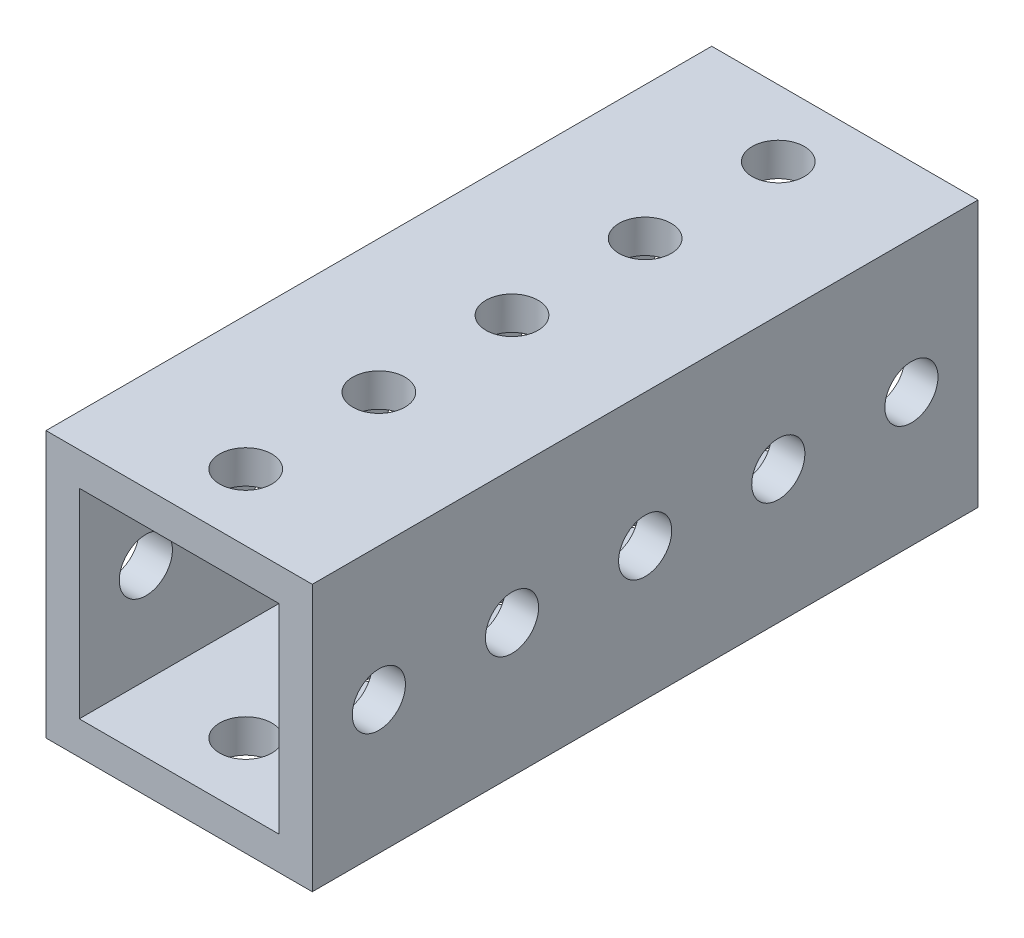
ISO-10303-21;
HEADER;
FILE_DESCRIPTION(('STEP AP214'),'2;1');
FILE_NAME('part.step','',(''),(''),'','','');
FILE_SCHEMA(('AUTOMOTIVE_DESIGN { 1 0 10303 214 1 1 1 1 }'));
ENDSEC;
DATA;
#1=APPLICATION_CONTEXT('core data for automotive mechanical design processes');
#2=APPLICATION_PROTOCOL_DEFINITION('international standard','automotive_design',2000,#1);
#3=PRODUCT_CONTEXT('',#1,'mechanical');
#4=PRODUCT('Part','Part','',(#3));
#5=PRODUCT_RELATED_PRODUCT_CATEGORY('part','',(#4));
#6=PRODUCT_DEFINITION_FORMATION('','',#4);
#7=PRODUCT_DEFINITION_CONTEXT('part definition',#1,'design');
#8=PRODUCT_DEFINITION('design','',#6,#7);
#9=PRODUCT_DEFINITION_SHAPE('','',#8);
#10=(LENGTH_UNIT() NAMED_UNIT(*) SI_UNIT(.MILLI.,.METRE.));
#11=(NAMED_UNIT(*) PLANE_ANGLE_UNIT() SI_UNIT($,.RADIAN.));
#12=(NAMED_UNIT(*) SI_UNIT($,.STERADIAN.) SOLID_ANGLE_UNIT());
#13=UNCERTAINTY_MEASURE_WITH_UNIT(LENGTH_MEASURE(1.E-05),#10,'distance_accuracy_value','');
#14=(GEOMETRIC_REPRESENTATION_CONTEXT(3) GLOBAL_UNCERTAINTY_ASSIGNED_CONTEXT((#13)) GLOBAL_UNIT_ASSIGNED_CONTEXT((#10,
#11,#12)) REPRESENTATION_CONTEXT('',''));
#15=CARTESIAN_POINT('',(0.,0.,0.));
#16=DIRECTION('',(0.,0.,1.));
#17=DIRECTION('',(1.,0.,0.));
#18=AXIS2_PLACEMENT_3D('',#15,#16,#17);
#19=CARTESIAN_POINT('',(0.,0.,63.5));
#20=DIRECTION('',(0.,0.,-1.));
#21=DIRECTION('',(-1.,0.,0.));
#22=AXIS2_PLACEMENT_3D('',#19,#20,#21);
#23=PLANE('',#22);
#24=DIRECTION('',(0.,-1.,0.));
#25=VECTOR('',#24,1.);
#26=CARTESIAN_POINT('',(0.,0.,63.5));
#27=LINE('',#26,#25);
#28=CARTESIAN_POINT('',(0.,25.4,63.5));
#29=VERTEX_POINT('',#28);
#30=CARTESIAN_POINT('',(0.,0.,63.5));
#31=VERTEX_POINT('',#30);
#32=EDGE_CURVE('E155',#29,#31,#27,.T.);
#33=ORIENTED_EDGE('',*,*,#32,.T.);
#34=DIRECTION('',(1.,0.,0.));
#35=VECTOR('',#34,1.);
#36=CARTESIAN_POINT('',(0.,0.,63.5));
#37=LINE('',#36,#35);
#38=CARTESIAN_POINT('',(25.4,0.,63.5));
#39=VERTEX_POINT('',#38);
#40=EDGE_CURVE('E159',#31,#39,#37,.T.);
#41=ORIENTED_EDGE('',*,*,#40,.T.);
#42=DIRECTION('',(0.,1.,0.));
#43=VECTOR('',#42,1.);
#44=CARTESIAN_POINT('',(25.4,0.,63.5));
#45=LINE('',#44,#43);
#46=CARTESIAN_POINT('',(25.4,25.4,63.5));
#47=VERTEX_POINT('',#46);
#48=EDGE_CURVE('E163',#39,#47,#45,.T.);
#49=ORIENTED_EDGE('',*,*,#48,.T.);
#50=DIRECTION('',(-1.,0.,0.));
#51=VECTOR('',#50,1.);
#52=CARTESIAN_POINT('',(0.,25.4,63.5));
#53=LINE('',#52,#51);
#54=EDGE_CURVE('E166',#47,#29,#53,.T.);
#55=ORIENTED_EDGE('',*,*,#54,.T.);
#56=EDGE_LOOP('',(#33,#41,#49,#55));
#57=FACE_BOUND('',#56,.T.);
#58=DIRECTION('',(0.,-1.,0.));
#59=VECTOR('',#58,1.);
#60=CARTESIAN_POINT('',(3.175,0.,63.5));
#61=LINE('',#60,#59);
#62=CARTESIAN_POINT('',(3.17499999999999,22.225,63.5));
#63=VERTEX_POINT('',#62);
#64=CARTESIAN_POINT('',(3.175,3.175,63.5));
#65=VERTEX_POINT('',#64);
#66=EDGE_CURVE('E137',#63,#65,#61,.T.);
#67=ORIENTED_EDGE('',*,*,#66,.F.);
#68=DIRECTION('',(-1.,0.,0.));
#69=VECTOR('',#68,1.);
#70=CARTESIAN_POINT('',(0.,22.225,63.5));
#71=LINE('',#70,#69);
#72=CARTESIAN_POINT('',(22.225,22.225,63.5));
#73=VERTEX_POINT('',#72);
#74=EDGE_CURVE('E118',#73,#63,#71,.T.);
#75=ORIENTED_EDGE('',*,*,#74,.F.);
#76=DIRECTION('',(0.,1.,0.));
#77=VECTOR('',#76,1.);
#78=CARTESIAN_POINT('',(22.225,0.,63.5));
#79=LINE('',#78,#77);
#80=CARTESIAN_POINT('',(22.225,3.175,63.5));
#81=VERTEX_POINT('',#80);
#82=EDGE_CURVE('E150',#81,#73,#79,.T.);
#83=ORIENTED_EDGE('',*,*,#82,.F.);
#84=DIRECTION('',(1.,0.,0.));
#85=VECTOR('',#84,1.);
#86=CARTESIAN_POINT('',(0.,3.175,63.5));
#87=LINE('',#86,#85);
#88=EDGE_CURVE('E141',#65,#81,#87,.T.);
#89=ORIENTED_EDGE('',*,*,#88,.F.);
#90=EDGE_LOOP('',(#67,#75,#83,#89));
#91=FACE_BOUND('',#90,.T.);
#92=ADVANCED_FACE('F45',(#57,#91),#23,.F.);
#93=CARTESIAN_POINT('',(0.,0.,0.));
#94=DIRECTION('',(0.,0.,-1.));
#95=DIRECTION('',(-1.,0.,0.));
#96=AXIS2_PLACEMENT_3D('',#93,#94,#95);
#97=PLANE('',#96);
#98=DIRECTION('',(0.,-1.,0.));
#99=VECTOR('',#98,1.);
#100=CARTESIAN_POINT('',(0.,0.,0.));
#101=LINE('',#100,#99);
#102=CARTESIAN_POINT('',(0.,25.4,0.));
#103=VERTEX_POINT('',#102);
#104=CARTESIAN_POINT('',(0.,0.,0.));
#105=VERTEX_POINT('',#104);
#106=EDGE_CURVE('E170',#103,#105,#101,.T.);
#107=ORIENTED_EDGE('',*,*,#106,.F.);
#108=DIRECTION('',(-1.,0.,0.));
#109=VECTOR('',#108,1.);
#110=CARTESIAN_POINT('',(0.,25.4,0.));
#111=LINE('',#110,#109);
#112=CARTESIAN_POINT('',(25.4,25.4,0.));
#113=VERTEX_POINT('',#112);
#114=EDGE_CURVE('E160',#113,#103,#111,.T.);
#115=ORIENTED_EDGE('',*,*,#114,.F.);
#116=DIRECTION('',(0.,1.,0.));
#117=VECTOR('',#116,1.);
#118=CARTESIAN_POINT('',(25.4,0.,0.));
#119=LINE('',#118,#117);
#120=CARTESIAN_POINT('',(25.4,0.,0.));
#121=VERTEX_POINT('',#120);
#122=EDGE_CURVE('E177',#121,#113,#119,.T.);
#123=ORIENTED_EDGE('',*,*,#122,.F.);
#124=DIRECTION('',(1.,0.,0.));
#125=VECTOR('',#124,1.);
#126=CARTESIAN_POINT('',(0.,0.,0.));
#127=LINE('',#126,#125);
#128=EDGE_CURVE('E174',#105,#121,#127,.T.);
#129=ORIENTED_EDGE('',*,*,#128,.F.);
#130=EDGE_LOOP('',(#107,#115,#123,#129));
#131=FACE_BOUND('',#130,.T.);
#132=DIRECTION('',(-1.,0.,0.));
#133=VECTOR('',#132,1.);
#134=CARTESIAN_POINT('',(0.,22.225,0.));
#135=LINE('',#134,#133);
#136=CARTESIAN_POINT('',(22.225,22.225,0.));
#137=VERTEX_POINT('',#136);
#138=CARTESIAN_POINT('',(3.17499999999999,22.225,0.));
#139=VERTEX_POINT('',#138);
#140=EDGE_CURVE('E116',#137,#139,#135,.T.);
#141=ORIENTED_EDGE('',*,*,#140,.T.);
#142=DIRECTION('',(0.,-1.,0.));
#143=VECTOR('',#142,1.);
#144=CARTESIAN_POINT('',(3.175,0.,0.));
#145=LINE('',#144,#143);
#146=CARTESIAN_POINT('',(3.175,3.175,0.));
#147=VERTEX_POINT('',#146);
#148=EDGE_CURVE('E125',#139,#147,#145,.T.);
#149=ORIENTED_EDGE('',*,*,#148,.T.);
#150=DIRECTION('',(1.,0.,0.));
#151=VECTOR('',#150,1.);
#152=CARTESIAN_POINT('',(0.,3.175,0.));
#153=LINE('',#152,#151);
#154=CARTESIAN_POINT('',(22.225,3.175,0.));
#155=VERTEX_POINT('',#154);
#156=EDGE_CURVE('E132',#147,#155,#153,.T.);
#157=ORIENTED_EDGE('',*,*,#156,.T.);
#158=DIRECTION('',(0.,1.,0.));
#159=VECTOR('',#158,1.);
#160=CARTESIAN_POINT('',(22.225,0.,0.));
#161=LINE('',#160,#159);
#162=EDGE_CURVE('E70',#155,#137,#161,.T.);
#163=ORIENTED_EDGE('',*,*,#162,.T.);
#164=EDGE_LOOP('',(#141,#149,#157,#163));
#165=FACE_BOUND('',#164,.T.);
#166=ADVANCED_FACE('F135',(#131,#165),#97,.T.);
#167=CARTESIAN_POINT('',(0.,0.,63.5));
#168=DIRECTION('',(1.,0.,0.));
#169=DIRECTION('',(0.,1.,0.));
#170=AXIS2_PLACEMENT_3D('',#167,#168,#169);
#171=PLANE('',#170);
#172=CARTESIAN_POINT('',(0.,12.7,57.15));
#173=DIRECTION('',(1.,0.,0.));
#174=DIRECTION('',(0.,1.,0.));
#175=AXIS2_PLACEMENT_3D('',#172,#173,#174);
#176=CIRCLE('',#175,2.53492000000001);
#177=CARTESIAN_POINT('',(0.,15.23492,57.15));
#178=VERTEX_POINT('',#177);
#179=EDGE_CURVE('E267',#178,#178,#176,.T.);
#180=ORIENTED_EDGE('',*,*,#179,.T.);
#181=EDGE_LOOP('',(#180));
#182=FACE_BOUND('',#181,.T.);
#183=CARTESIAN_POINT('',(0.,12.7,44.45));
#184=DIRECTION('',(1.,0.,0.));
#185=DIRECTION('',(0.,1.,0.));
#186=AXIS2_PLACEMENT_3D('',#183,#184,#185);
#187=CIRCLE('',#186,2.53492000000001);
#188=CARTESIAN_POINT('',(0.,15.23492,44.45));
#189=VERTEX_POINT('',#188);
#190=EDGE_CURVE('E249',#189,#189,#187,.T.);
#191=ORIENTED_EDGE('',*,*,#190,.T.);
#192=EDGE_LOOP('',(#191));
#193=FACE_BOUND('',#192,.T.);
#194=CARTESIAN_POINT('',(0.,12.7,31.75));
#195=DIRECTION('',(1.,0.,0.));
#196=DIRECTION('',(0.,1.,0.));
#197=AXIS2_PLACEMENT_3D('',#194,#195,#196);
#198=CIRCLE('',#197,2.53492000000001);
#199=CARTESIAN_POINT('',(0.,15.23492,31.75));
#200=VERTEX_POINT('',#199);
#201=EDGE_CURVE('E243',#200,#200,#198,.T.);
#202=ORIENTED_EDGE('',*,*,#201,.T.);
#203=EDGE_LOOP('',(#202));
#204=FACE_BOUND('',#203,.T.);
#205=CARTESIAN_POINT('',(0.,12.7,19.05));
#206=DIRECTION('',(1.,0.,0.));
#207=DIRECTION('',(0.,1.,0.));
#208=AXIS2_PLACEMENT_3D('',#205,#206,#207);
#209=CIRCLE('',#208,2.53492000000001);
#210=CARTESIAN_POINT('',(0.,15.23492,19.05));
#211=VERTEX_POINT('',#210);
#212=EDGE_CURVE('E238',#211,#211,#209,.T.);
#213=ORIENTED_EDGE('',*,*,#212,.T.);
#214=EDGE_LOOP('',(#213));
#215=FACE_BOUND('',#214,.T.);
#216=CARTESIAN_POINT('',(0.,12.7,6.35));
#217=DIRECTION('',(1.,0.,0.));
#218=DIRECTION('',(0.,1.,0.));
#219=AXIS2_PLACEMENT_3D('',#216,#217,#218);
#220=CIRCLE('',#219,2.53492000000001);
#221=CARTESIAN_POINT('',(0.,15.23492,6.35));
#222=VERTEX_POINT('',#221);
#223=EDGE_CURVE('E233',#222,#222,#220,.T.);
#224=ORIENTED_EDGE('',*,*,#223,.T.);
#225=EDGE_LOOP('',(#224));
#226=FACE_BOUND('',#225,.T.);
#227=ORIENTED_EDGE('',*,*,#106,.T.);
#228=DIRECTION('',(0.,0.,-1.));
#229=VECTOR('',#228,1.);
#230=CARTESIAN_POINT('',(0.,0.,63.5));
#231=LINE('',#230,#229);
#232=EDGE_CURVE('E11',#31,#105,#231,.T.);
#233=ORIENTED_EDGE('',*,*,#232,.F.);
#234=ORIENTED_EDGE('',*,*,#32,.F.);
#235=DIRECTION('',(0.,0.,-1.));
#236=VECTOR('',#235,1.);
#237=CARTESIAN_POINT('',(0.,25.4,63.5));
#238=LINE('',#237,#236);
#239=EDGE_CURVE('E169',#29,#103,#238,.T.);
#240=ORIENTED_EDGE('',*,*,#239,.T.);
#241=EDGE_LOOP('',(#227,#233,#234,#240));
#242=FACE_BOUND('',#241,.T.);
#243=ADVANCED_FACE('F47',(#182,#193,#204,#215,#226,#242),#171,.F.);
#244=CARTESIAN_POINT('',(0.,0.,63.5));
#245=DIRECTION('',(0.,1.,0.));
#246=DIRECTION('',(0.,0.,1.));
#247=AXIS2_PLACEMENT_3D('',#244,#245,#246);
#248=PLANE('',#247);
#249=CARTESIAN_POINT('',(12.7,0.,6.35));
#250=DIRECTION('',(0.,1.,0.));
#251=DIRECTION('',(0.,0.,1.));
#252=AXIS2_PLACEMENT_3D('',#249,#250,#251);
#253=CIRCLE('',#252,2.4892);
#254=CARTESIAN_POINT('',(12.7,0.,8.8392));
#255=VERTEX_POINT('',#254);
#256=EDGE_CURVE('E133',#255,#255,#253,.T.);
#257=ORIENTED_EDGE('',*,*,#256,.T.);
#258=EDGE_LOOP('',(#257));
#259=FACE_BOUND('',#258,.T.);
#260=CARTESIAN_POINT('',(12.7,0.,19.05));
#261=DIRECTION('',(0.,1.,0.));
#262=DIRECTION('',(0.,0.,1.));
#263=AXIS2_PLACEMENT_3D('',#260,#261,#262);
#264=CIRCLE('',#263,2.4892);
#265=CARTESIAN_POINT('',(12.7,0.,21.5392));
#266=VERTEX_POINT('',#265);
#267=EDGE_CURVE('E221',#266,#266,#264,.T.);
#268=ORIENTED_EDGE('',*,*,#267,.T.);
#269=EDGE_LOOP('',(#268));
#270=FACE_BOUND('',#269,.T.);
#271=CARTESIAN_POINT('',(12.7,0.,31.75));
#272=DIRECTION('',(0.,1.,0.));
#273=DIRECTION('',(0.,0.,1.));
#274=AXIS2_PLACEMENT_3D('',#271,#272,#273);
#275=CIRCLE('',#274,2.4892);
#276=CARTESIAN_POINT('',(12.7,0.,34.2392));
#277=VERTEX_POINT('',#276);
#278=EDGE_CURVE('E215',#277,#277,#275,.T.);
#279=ORIENTED_EDGE('',*,*,#278,.T.);
#280=EDGE_LOOP('',(#279));
#281=FACE_BOUND('',#280,.T.);
#282=CARTESIAN_POINT('',(12.7,0.,44.45));
#283=DIRECTION('',(0.,1.,0.));
#284=DIRECTION('',(0.,0.,1.));
#285=AXIS2_PLACEMENT_3D('',#282,#283,#284);
#286=CIRCLE('',#285,2.4892);
#287=CARTESIAN_POINT('',(12.7,0.,46.9392));
#288=VERTEX_POINT('',#287);
#289=EDGE_CURVE('E209',#288,#288,#286,.T.);
#290=ORIENTED_EDGE('',*,*,#289,.T.);
#291=EDGE_LOOP('',(#290));
#292=FACE_BOUND('',#291,.T.);
#293=CARTESIAN_POINT('',(12.7,0.,57.15));
#294=DIRECTION('',(0.,1.,0.));
#295=DIRECTION('',(0.,0.,1.));
#296=AXIS2_PLACEMENT_3D('',#293,#294,#295);
#297=CIRCLE('',#296,2.4892);
#298=CARTESIAN_POINT('',(12.7,0.,59.6392));
#299=VERTEX_POINT('',#298);
#300=EDGE_CURVE('E203',#299,#299,#297,.T.);
#301=ORIENTED_EDGE('',*,*,#300,.T.);
#302=EDGE_LOOP('',(#301));
#303=FACE_BOUND('',#302,.T.);
#304=ORIENTED_EDGE('',*,*,#128,.T.);
#305=DIRECTION('',(0.,0.,-1.));
#306=VECTOR('',#305,1.);
#307=CARTESIAN_POINT('',(25.4,0.,63.5));
#308=LINE('',#307,#306);
#309=EDGE_CURVE('E55',#39,#121,#308,.T.);
#310=ORIENTED_EDGE('',*,*,#309,.F.);
#311=ORIENTED_EDGE('',*,*,#40,.F.);
#312=ORIENTED_EDGE('',*,*,#232,.T.);
#313=EDGE_LOOP('',(#304,#310,#311,#312));
#314=FACE_BOUND('',#313,.T.);
#315=ADVANCED_FACE('F361',(#259,#270,#281,#292,#303,#314),#248,.F.);
#316=CARTESIAN_POINT('',(25.4,0.,63.5));
#317=DIRECTION('',(-1.,0.,0.));
#318=DIRECTION('',(0.,-1.,0.));
#319=AXIS2_PLACEMENT_3D('',#316,#317,#318);
#320=PLANE('',#319);
#321=CARTESIAN_POINT('',(25.4,12.7,57.15));
#322=DIRECTION('',(1.,0.,0.));
#323=DIRECTION('',(0.,1.,0.));
#324=AXIS2_PLACEMENT_3D('',#321,#322,#323);
#325=CIRCLE('',#324,2.53492000000001);
#326=CARTESIAN_POINT('',(25.4,15.23492,57.15));
#327=VERTEX_POINT('',#326);
#328=EDGE_CURVE('E227',#327,#327,#325,.T.);
#329=ORIENTED_EDGE('',*,*,#328,.F.);
#330=EDGE_LOOP('',(#329));
#331=FACE_BOUND('',#330,.T.);
#332=CARTESIAN_POINT('',(25.4,12.7,44.45));
#333=DIRECTION('',(1.,0.,0.));
#334=DIRECTION('',(0.,1.,0.));
#335=AXIS2_PLACEMENT_3D('',#332,#333,#334);
#336=CIRCLE('',#335,2.53492000000001);
#337=CARTESIAN_POINT('',(25.4,15.23492,44.45));
#338=VERTEX_POINT('',#337);
#339=EDGE_CURVE('E708',#338,#338,#336,.T.);
#340=ORIENTED_EDGE('',*,*,#339,.F.);
#341=EDGE_LOOP('',(#340));
#342=FACE_BOUND('',#341,.T.);
#343=CARTESIAN_POINT('',(25.4,12.7,31.75));
#344=DIRECTION('',(1.,0.,0.));
#345=DIRECTION('',(0.,1.,0.));
#346=AXIS2_PLACEMENT_3D('',#343,#344,#345);
#347=CIRCLE('',#346,2.53492000000001);
#348=CARTESIAN_POINT('',(25.4,15.23492,31.75));
#349=VERTEX_POINT('',#348);
#350=EDGE_CURVE('E704',#349,#349,#347,.T.);
#351=ORIENTED_EDGE('',*,*,#350,.F.);
#352=EDGE_LOOP('',(#351));
#353=FACE_BOUND('',#352,.T.);
#354=CARTESIAN_POINT('',(25.4,12.7,19.05));
#355=DIRECTION('',(1.,0.,0.));
#356=DIRECTION('',(0.,1.,0.));
#357=AXIS2_PLACEMENT_3D('',#354,#355,#356);
#358=CIRCLE('',#357,2.53492000000001);
#359=CARTESIAN_POINT('',(25.4,15.23492,19.05));
#360=VERTEX_POINT('',#359);
#361=EDGE_CURVE('E700',#360,#360,#358,.T.);
#362=ORIENTED_EDGE('',*,*,#361,.F.);
#363=EDGE_LOOP('',(#362));
#364=FACE_BOUND('',#363,.T.);
#365=CARTESIAN_POINT('',(25.4,12.7,6.35));
#366=DIRECTION('',(1.,0.,0.));
#367=DIRECTION('',(0.,1.,0.));
#368=AXIS2_PLACEMENT_3D('',#365,#366,#367);
#369=CIRCLE('',#368,2.53492000000001);
#370=CARTESIAN_POINT('',(25.4,15.23492,6.35));
#371=VERTEX_POINT('',#370);
#372=EDGE_CURVE('E696',#371,#371,#369,.T.);
#373=ORIENTED_EDGE('',*,*,#372,.F.);
#374=EDGE_LOOP('',(#373));
#375=FACE_BOUND('',#374,.T.);
#376=ORIENTED_EDGE('',*,*,#122,.T.);
#377=DIRECTION('',(0.,0.,-1.));
#378=VECTOR('',#377,1.);
#379=CARTESIAN_POINT('',(25.4,25.4,63.5));
#380=LINE('',#379,#378);
#381=EDGE_CURVE('E185',#47,#113,#380,.T.);
#382=ORIENTED_EDGE('',*,*,#381,.F.);
#383=ORIENTED_EDGE('',*,*,#48,.F.);
#384=ORIENTED_EDGE('',*,*,#309,.T.);
#385=EDGE_LOOP('',(#376,#382,#383,#384));
#386=FACE_BOUND('',#385,.T.);
#387=ADVANCED_FACE('F358',(#331,#342,#353,#364,#375,#386),#320,.F.);
#388=CARTESIAN_POINT('',(0.,25.4,63.5));
#389=DIRECTION('',(0.,-1.,0.));
#390=DIRECTION('',(0.,0.,-1.));
#391=AXIS2_PLACEMENT_3D('',#388,#389,#390);
#392=PLANE('',#391);
#393=CARTESIAN_POINT('',(12.7,25.4,6.35));
#394=DIRECTION('',(0.,1.,0.));
#395=DIRECTION('',(0.,0.,1.));
#396=AXIS2_PLACEMENT_3D('',#393,#394,#395);
#397=CIRCLE('',#396,2.4892);
#398=CARTESIAN_POINT('',(12.7,25.4,8.8392));
#399=VERTEX_POINT('',#398);
#400=EDGE_CURVE('E197',#399,#399,#397,.T.);
#401=ORIENTED_EDGE('',*,*,#400,.F.);
#402=EDGE_LOOP('',(#401));
#403=FACE_BOUND('',#402,.T.);
#404=CARTESIAN_POINT('',(12.7,25.4,19.05));
#405=DIRECTION('',(0.,1.,0.));
#406=DIRECTION('',(0.,0.,1.));
#407=AXIS2_PLACEMENT_3D('',#404,#405,#406);
#408=CIRCLE('',#407,2.4892);
#409=CARTESIAN_POINT('',(12.7,25.4,21.5392));
#410=VERTEX_POINT('',#409);
#411=EDGE_CURVE('E275',#410,#410,#408,.T.);
#412=ORIENTED_EDGE('',*,*,#411,.F.);
#413=EDGE_LOOP('',(#412));
#414=FACE_BOUND('',#413,.T.);
#415=CARTESIAN_POINT('',(12.7,25.4,31.75));
#416=DIRECTION('',(0.,1.,0.));
#417=DIRECTION('',(0.,0.,1.));
#418=AXIS2_PLACEMENT_3D('',#415,#416,#417);
#419=CIRCLE('',#418,2.4892);
#420=CARTESIAN_POINT('',(12.7,25.4,34.2392));
#421=VERTEX_POINT('',#420);
#422=EDGE_CURVE('E279',#421,#421,#419,.T.);
#423=ORIENTED_EDGE('',*,*,#422,.F.);
#424=EDGE_LOOP('',(#423));
#425=FACE_BOUND('',#424,.T.);
#426=CARTESIAN_POINT('',(12.7,25.4,44.45));
#427=DIRECTION('',(0.,1.,0.));
#428=DIRECTION('',(0.,0.,1.));
#429=AXIS2_PLACEMENT_3D('',#426,#427,#428);
#430=CIRCLE('',#429,2.4892);
#431=CARTESIAN_POINT('',(12.7,25.4,46.9392));
#432=VERTEX_POINT('',#431);
#433=EDGE_CURVE('E283',#432,#432,#430,.T.);
#434=ORIENTED_EDGE('',*,*,#433,.F.);
#435=EDGE_LOOP('',(#434));
#436=FACE_BOUND('',#435,.T.);
#437=CARTESIAN_POINT('',(12.7,25.4,57.15));
#438=DIRECTION('',(0.,1.,0.));
#439=DIRECTION('',(0.,0.,1.));
#440=AXIS2_PLACEMENT_3D('',#437,#438,#439);
#441=CIRCLE('',#440,2.4892);
#442=CARTESIAN_POINT('',(12.7,25.4,59.6392));
#443=VERTEX_POINT('',#442);
#444=EDGE_CURVE('E271',#443,#443,#441,.T.);
#445=ORIENTED_EDGE('',*,*,#444,.F.);
#446=EDGE_LOOP('',(#445));
#447=FACE_BOUND('',#446,.T.);
#448=ORIENTED_EDGE('',*,*,#114,.T.);
#449=ORIENTED_EDGE('',*,*,#239,.F.);
#450=ORIENTED_EDGE('',*,*,#54,.F.);
#451=ORIENTED_EDGE('',*,*,#381,.T.);
#452=EDGE_LOOP('',(#448,#449,#450,#451));
#453=FACE_BOUND('',#452,.T.);
#454=ADVANCED_FACE('F342',(#403,#414,#425,#436,#447,#453),#392,.F.);
#455=CARTESIAN_POINT('',(3.175,0.,63.5));
#456=DIRECTION('',(1.,0.,0.));
#457=DIRECTION('',(0.,1.,0.));
#458=AXIS2_PLACEMENT_3D('',#455,#456,#457);
#459=PLANE('',#458);
#460=CARTESIAN_POINT('',(3.175,12.7,57.15));
#461=DIRECTION('',(1.,0.,0.));
#462=DIRECTION('',(0.,1.,0.));
#463=AXIS2_PLACEMENT_3D('',#460,#461,#462);
#464=CIRCLE('',#463,2.53492000000001);
#465=CARTESIAN_POINT('',(3.175,15.23492,57.15));
#466=VERTEX_POINT('',#465);
#467=EDGE_CURVE('E263',#466,#466,#464,.T.);
#468=ORIENTED_EDGE('',*,*,#467,.F.);
#469=EDGE_LOOP('',(#468));
#470=FACE_BOUND('',#469,.T.);
#471=CARTESIAN_POINT('',(3.175,12.7,44.45));
#472=DIRECTION('',(1.,0.,0.));
#473=DIRECTION('',(0.,1.,0.));
#474=AXIS2_PLACEMENT_3D('',#471,#472,#473);
#475=CIRCLE('',#474,2.53492000000001);
#476=CARTESIAN_POINT('',(3.175,15.23492,44.45));
#477=VERTEX_POINT('',#476);
#478=EDGE_CURVE('E242',#477,#477,#475,.T.);
#479=ORIENTED_EDGE('',*,*,#478,.F.);
#480=EDGE_LOOP('',(#479));
#481=FACE_BOUND('',#480,.T.);
#482=CARTESIAN_POINT('',(3.175,12.7,31.75));
#483=DIRECTION('',(1.,0.,0.));
#484=DIRECTION('',(0.,1.,0.));
#485=AXIS2_PLACEMENT_3D('',#482,#483,#484);
#486=CIRCLE('',#485,2.53492000000001);
#487=CARTESIAN_POINT('',(3.175,15.23492,31.75));
#488=VERTEX_POINT('',#487);
#489=EDGE_CURVE('E237',#488,#488,#486,.T.);
#490=ORIENTED_EDGE('',*,*,#489,.F.);
#491=EDGE_LOOP('',(#490));
#492=FACE_BOUND('',#491,.T.);
#493=CARTESIAN_POINT('',(3.175,12.7,19.05));
#494=DIRECTION('',(1.,0.,0.));
#495=DIRECTION('',(0.,1.,0.));
#496=AXIS2_PLACEMENT_3D('',#493,#494,#495);
#497=CIRCLE('',#496,2.53492000000001);
#498=CARTESIAN_POINT('',(3.175,15.23492,19.05));
#499=VERTEX_POINT('',#498);
#500=EDGE_CURVE('E232',#499,#499,#497,.T.);
#501=ORIENTED_EDGE('',*,*,#500,.F.);
#502=EDGE_LOOP('',(#501));
#503=FACE_BOUND('',#502,.T.);
#504=CARTESIAN_POINT('',(3.175,12.7,6.35));
#505=DIRECTION('',(1.,0.,0.));
#506=DIRECTION('',(0.,1.,0.));
#507=AXIS2_PLACEMENT_3D('',#504,#505,#506);
#508=CIRCLE('',#507,2.53492000000001);
#509=CARTESIAN_POINT('',(3.175,15.23492,6.35));
#510=VERTEX_POINT('',#509);
#511=EDGE_CURVE('E226',#510,#510,#508,.T.);
#512=ORIENTED_EDGE('',*,*,#511,.F.);
#513=EDGE_LOOP('',(#512));
#514=FACE_BOUND('',#513,.T.);
#515=ORIENTED_EDGE('',*,*,#148,.F.);
#516=DIRECTION('',(0.,0.,-1.));
#517=VECTOR('',#516,1.);
#518=CARTESIAN_POINT('',(3.17499999999999,22.225,63.5));
#519=LINE('',#518,#517);
#520=EDGE_CURVE('E112',#63,#139,#519,.T.);
#521=ORIENTED_EDGE('',*,*,#520,.F.);
#522=ORIENTED_EDGE('',*,*,#66,.T.);
#523=DIRECTION('',(0.,0.,-1.));
#524=VECTOR('',#523,1.);
#525=CARTESIAN_POINT('',(3.175,3.175,63.5));
#526=LINE('',#525,#524);
#527=EDGE_CURVE('E128',#65,#147,#526,.T.);
#528=ORIENTED_EDGE('',*,*,#527,.T.);
#529=EDGE_LOOP('',(#515,#521,#522,#528));
#530=FACE_BOUND('',#529,.T.);
#531=ADVANCED_FACE('F126',(#470,#481,#492,#503,#514,#530),#459,.T.);
#532=CARTESIAN_POINT('',(0.,3.175,63.5));
#533=DIRECTION('',(0.,1.,0.));
#534=DIRECTION('',(0.,0.,1.));
#535=AXIS2_PLACEMENT_3D('',#532,#533,#534);
#536=PLANE('',#535);
#537=CARTESIAN_POINT('',(12.7,3.175,6.35));
#538=DIRECTION('',(0.,1.,0.));
#539=DIRECTION('',(0.,0.,1.));
#540=AXIS2_PLACEMENT_3D('',#537,#538,#539);
#541=CIRCLE('',#540,2.4892);
#542=CARTESIAN_POINT('',(12.7,3.175,8.8392));
#543=VERTEX_POINT('',#542);
#544=EDGE_CURVE('E220',#543,#543,#541,.T.);
#545=ORIENTED_EDGE('',*,*,#544,.F.);
#546=EDGE_LOOP('',(#545));
#547=FACE_BOUND('',#546,.T.);
#548=CARTESIAN_POINT('',(12.7,3.175,19.05));
#549=DIRECTION('',(0.,1.,0.));
#550=DIRECTION('',(0.,0.,1.));
#551=AXIS2_PLACEMENT_3D('',#548,#549,#550);
#552=CIRCLE('',#551,2.4892);
#553=CARTESIAN_POINT('',(12.7,3.175,21.5392));
#554=VERTEX_POINT('',#553);
#555=EDGE_CURVE('E214',#554,#554,#552,.T.);
#556=ORIENTED_EDGE('',*,*,#555,.F.);
#557=EDGE_LOOP('',(#556));
#558=FACE_BOUND('',#557,.T.);
#559=CARTESIAN_POINT('',(12.7,3.175,31.75));
#560=DIRECTION('',(0.,1.,0.));
#561=DIRECTION('',(0.,0.,1.));
#562=AXIS2_PLACEMENT_3D('',#559,#560,#561);
#563=CIRCLE('',#562,2.4892);
#564=CARTESIAN_POINT('',(12.7,3.175,34.2392));
#565=VERTEX_POINT('',#564);
#566=EDGE_CURVE('E208',#565,#565,#563,.T.);
#567=ORIENTED_EDGE('',*,*,#566,.F.);
#568=EDGE_LOOP('',(#567));
#569=FACE_BOUND('',#568,.T.);
#570=CARTESIAN_POINT('',(12.7,3.175,44.45));
#571=DIRECTION('',(0.,1.,0.));
#572=DIRECTION('',(0.,0.,1.));
#573=AXIS2_PLACEMENT_3D('',#570,#571,#572);
#574=CIRCLE('',#573,2.4892);
#575=CARTESIAN_POINT('',(12.7,3.175,46.9392));
#576=VERTEX_POINT('',#575);
#577=EDGE_CURVE('E202',#576,#576,#574,.T.);
#578=ORIENTED_EDGE('',*,*,#577,.F.);
#579=EDGE_LOOP('',(#578));
#580=FACE_BOUND('',#579,.T.);
#581=CARTESIAN_POINT('',(12.7,3.175,57.15));
#582=DIRECTION('',(0.,1.,0.));
#583=DIRECTION('',(0.,0.,1.));
#584=AXIS2_PLACEMENT_3D('',#581,#582,#583);
#585=CIRCLE('',#584,2.4892);
#586=CARTESIAN_POINT('',(12.7,3.175,59.6392));
#587=VERTEX_POINT('',#586);
#588=EDGE_CURVE('E196',#587,#587,#585,.T.);
#589=ORIENTED_EDGE('',*,*,#588,.F.);
#590=EDGE_LOOP('',(#589));
#591=FACE_BOUND('',#590,.T.);
#592=ORIENTED_EDGE('',*,*,#156,.F.);
#593=ORIENTED_EDGE('',*,*,#527,.F.);
#594=ORIENTED_EDGE('',*,*,#88,.T.);
#595=DIRECTION('',(0.,0.,-1.));
#596=VECTOR('',#595,1.);
#597=CARTESIAN_POINT('',(22.225,3.175,63.5));
#598=LINE('',#597,#596);
#599=EDGE_CURVE('E321',#81,#155,#598,.T.);
#600=ORIENTED_EDGE('',*,*,#599,.T.);
#601=EDGE_LOOP('',(#592,#593,#594,#600));
#602=FACE_BOUND('',#601,.T.);
#603=ADVANCED_FACE('F330',(#547,#558,#569,#580,#591,#602),#536,.T.);
#604=CARTESIAN_POINT('',(22.225,0.,63.5));
#605=DIRECTION('',(-1.,0.,0.));
#606=DIRECTION('',(0.,-1.,0.));
#607=AXIS2_PLACEMENT_3D('',#604,#605,#606);
#608=PLANE('',#607);
#609=CARTESIAN_POINT('',(22.225,12.7,57.15));
#610=DIRECTION('',(-1.,0.,0.));
#611=DIRECTION('',(0.,-1.,0.));
#612=AXIS2_PLACEMENT_3D('',#609,#610,#611);
#613=CIRCLE('',#612,2.53492000000001);
#614=CARTESIAN_POINT('',(22.225,10.16508,57.15));
#615=VERTEX_POINT('',#614);
#616=EDGE_CURVE('E49',#615,#615,#613,.T.);
#617=ORIENTED_EDGE('',*,*,#616,.F.);
#618=EDGE_LOOP('',(#617));
#619=FACE_BOUND('',#618,.T.);
#620=CARTESIAN_POINT('',(22.225,12.7,44.45));
#621=DIRECTION('',(-1.,0.,0.));
#622=DIRECTION('',(0.,-1.,0.));
#623=AXIS2_PLACEMENT_3D('',#620,#621,#622);
#624=CIRCLE('',#623,2.53492000000001);
#625=CARTESIAN_POINT('',(22.225,10.16508,44.45));
#626=VERTEX_POINT('',#625);
#627=EDGE_CURVE('E239',#626,#626,#624,.T.);
#628=ORIENTED_EDGE('',*,*,#627,.F.);
#629=EDGE_LOOP('',(#628));
#630=FACE_BOUND('',#629,.T.);
#631=CARTESIAN_POINT('',(22.225,12.7,31.75));
#632=DIRECTION('',(-1.,0.,0.));
#633=DIRECTION('',(0.,-1.,0.));
#634=AXIS2_PLACEMENT_3D('',#631,#632,#633);
#635=CIRCLE('',#634,2.53492000000001);
#636=CARTESIAN_POINT('',(22.225,10.16508,31.75));
#637=VERTEX_POINT('',#636);
#638=EDGE_CURVE('E234',#637,#637,#635,.T.);
#639=ORIENTED_EDGE('',*,*,#638,.F.);
#640=EDGE_LOOP('',(#639));
#641=FACE_BOUND('',#640,.T.);
#642=CARTESIAN_POINT('',(22.225,12.7,19.05));
#643=DIRECTION('',(-1.,0.,0.));
#644=DIRECTION('',(0.,-1.,0.));
#645=AXIS2_PLACEMENT_3D('',#642,#643,#644);
#646=CIRCLE('',#645,2.53492000000001);
#647=CARTESIAN_POINT('',(22.225,10.16508,19.05));
#648=VERTEX_POINT('',#647);
#649=EDGE_CURVE('E228',#648,#648,#646,.T.);
#650=ORIENTED_EDGE('',*,*,#649,.F.);
#651=EDGE_LOOP('',(#650));
#652=FACE_BOUND('',#651,.T.);
#653=CARTESIAN_POINT('',(22.225,12.7,6.35));
#654=DIRECTION('',(-1.,0.,0.));
#655=DIRECTION('',(0.,-1.,0.));
#656=AXIS2_PLACEMENT_3D('',#653,#654,#655);
#657=CIRCLE('',#656,2.53492000000001);
#658=CARTESIAN_POINT('',(22.225,10.16508,6.35));
#659=VERTEX_POINT('',#658);
#660=EDGE_CURVE('E222',#659,#659,#657,.T.);
#661=ORIENTED_EDGE('',*,*,#660,.F.);
#662=EDGE_LOOP('',(#661));
#663=FACE_BOUND('',#662,.T.);
#664=ORIENTED_EDGE('',*,*,#162,.F.);
#665=ORIENTED_EDGE('',*,*,#599,.F.);
#666=ORIENTED_EDGE('',*,*,#82,.T.);
#667=DIRECTION('',(0.,0.,-1.));
#668=VECTOR('',#667,1.);
#669=CARTESIAN_POINT('',(22.225,22.225,63.5));
#670=LINE('',#669,#668);
#671=EDGE_CURVE('E63',#73,#137,#670,.T.);
#672=ORIENTED_EDGE('',*,*,#671,.T.);
#673=EDGE_LOOP('',(#664,#665,#666,#672));
#674=FACE_BOUND('',#673,.T.);
#675=ADVANCED_FACE('F325',(#619,#630,#641,#652,#663,#674),#608,.T.);
#676=CARTESIAN_POINT('',(0.,22.225,63.5));
#677=DIRECTION('',(0.,-1.,0.));
#678=DIRECTION('',(0.,0.,-1.));
#679=AXIS2_PLACEMENT_3D('',#676,#677,#678);
#680=PLANE('',#679);
#681=CARTESIAN_POINT('',(12.7,22.225,6.35));
#682=DIRECTION('',(0.,-1.,0.));
#683=DIRECTION('',(0.,0.,-1.));
#684=AXIS2_PLACEMENT_3D('',#681,#682,#683);
#685=CIRCLE('',#684,2.4892);
#686=CARTESIAN_POINT('',(12.7,22.225,3.8608));
#687=VERTEX_POINT('',#686);
#688=EDGE_CURVE('E216',#687,#687,#685,.T.);
#689=ORIENTED_EDGE('',*,*,#688,.F.);
#690=EDGE_LOOP('',(#689));
#691=FACE_BOUND('',#690,.T.);
#692=CARTESIAN_POINT('',(12.7,22.225,19.05));
#693=DIRECTION('',(0.,-1.,0.));
#694=DIRECTION('',(0.,0.,-1.));
#695=AXIS2_PLACEMENT_3D('',#692,#693,#694);
#696=CIRCLE('',#695,2.4892);
#697=CARTESIAN_POINT('',(12.7,22.225,16.5608));
#698=VERTEX_POINT('',#697);
#699=EDGE_CURVE('E210',#698,#698,#696,.T.);
#700=ORIENTED_EDGE('',*,*,#699,.F.);
#701=EDGE_LOOP('',(#700));
#702=FACE_BOUND('',#701,.T.);
#703=CARTESIAN_POINT('',(12.7,22.225,31.75));
#704=DIRECTION('',(0.,-1.,0.));
#705=DIRECTION('',(0.,0.,-1.));
#706=AXIS2_PLACEMENT_3D('',#703,#704,#705);
#707=CIRCLE('',#706,2.4892);
#708=CARTESIAN_POINT('',(12.7,22.225,29.2608));
#709=VERTEX_POINT('',#708);
#710=EDGE_CURVE('E204',#709,#709,#707,.T.);
#711=ORIENTED_EDGE('',*,*,#710,.F.);
#712=EDGE_LOOP('',(#711));
#713=FACE_BOUND('',#712,.T.);
#714=CARTESIAN_POINT('',(12.7,22.225,44.45));
#715=DIRECTION('',(0.,-1.,0.));
#716=DIRECTION('',(0.,0.,-1.));
#717=AXIS2_PLACEMENT_3D('',#714,#715,#716);
#718=CIRCLE('',#717,2.4892);
#719=CARTESIAN_POINT('',(12.7,22.225,41.9608));
#720=VERTEX_POINT('',#719);
#721=EDGE_CURVE('E198',#720,#720,#718,.T.);
#722=ORIENTED_EDGE('',*,*,#721,.F.);
#723=EDGE_LOOP('',(#722));
#724=FACE_BOUND('',#723,.T.);
#725=CARTESIAN_POINT('',(12.7,22.225,57.15));
#726=DIRECTION('',(0.,-1.,0.));
#727=DIRECTION('',(0.,0.,-1.));
#728=AXIS2_PLACEMENT_3D('',#725,#726,#727);
#729=CIRCLE('',#728,2.4892);
#730=CARTESIAN_POINT('',(12.7,22.225,54.6608));
#731=VERTEX_POINT('',#730);
#732=EDGE_CURVE('E192',#731,#731,#729,.T.);
#733=ORIENTED_EDGE('',*,*,#732,.F.);
#734=EDGE_LOOP('',(#733));
#735=FACE_BOUND('',#734,.T.);
#736=ORIENTED_EDGE('',*,*,#140,.F.);
#737=ORIENTED_EDGE('',*,*,#671,.F.);
#738=ORIENTED_EDGE('',*,*,#74,.T.);
#739=ORIENTED_EDGE('',*,*,#520,.T.);
#740=EDGE_LOOP('',(#736,#737,#738,#739));
#741=FACE_BOUND('',#740,.T.);
#742=ADVANCED_FACE('F114',(#691,#702,#713,#724,#735,#741),#680,.T.);
#743=CARTESIAN_POINT('',(12.7,-38.1,57.15));
#744=DIRECTION('',(0.,1.,0.));
#745=DIRECTION('',(0.,0.,1.));
#746=AXIS2_PLACEMENT_3D('',#743,#744,#745);
#747=CYLINDRICAL_SURFACE('',#746,2.4892);
#748=ORIENTED_EDGE('',*,*,#732,.T.);
#749=EDGE_LOOP('',(#748));
#750=FACE_BOUND('',#749,.T.);
#751=ORIENTED_EDGE('',*,*,#444,.T.);
#752=EDGE_LOOP('',(#751));
#753=FACE_BOUND('',#752,.T.);
#754=ADVANCED_FACE('F399',(#750,#753),#747,.F.);
#755=CARTESIAN_POINT('',(12.7,-38.1,44.45));
#756=DIRECTION('',(0.,1.,0.));
#757=DIRECTION('',(0.,0.,1.));
#758=AXIS2_PLACEMENT_3D('',#755,#756,#757);
#759=CYLINDRICAL_SURFACE('',#758,2.4892);
#760=ORIENTED_EDGE('',*,*,#721,.T.);
#761=EDGE_LOOP('',(#760));
#762=FACE_BOUND('',#761,.T.);
#763=ORIENTED_EDGE('',*,*,#433,.T.);
#764=EDGE_LOOP('',(#763));
#765=FACE_BOUND('',#764,.T.);
#766=ADVANCED_FACE('F407',(#762,#765),#759,.F.);
#767=CARTESIAN_POINT('',(12.7,-38.1,31.75));
#768=DIRECTION('',(0.,1.,0.));
#769=DIRECTION('',(0.,0.,1.));
#770=AXIS2_PLACEMENT_3D('',#767,#768,#769);
#771=CYLINDRICAL_SURFACE('',#770,2.4892);
#772=ORIENTED_EDGE('',*,*,#710,.T.);
#773=EDGE_LOOP('',(#772));
#774=FACE_BOUND('',#773,.T.);
#775=ORIENTED_EDGE('',*,*,#422,.T.);
#776=EDGE_LOOP('',(#775));
#777=FACE_BOUND('',#776,.T.);
#778=ADVANCED_FACE('F417',(#774,#777),#771,.F.);
#779=CARTESIAN_POINT('',(12.7,-38.1,19.05));
#780=DIRECTION('',(0.,1.,0.));
#781=DIRECTION('',(0.,0.,1.));
#782=AXIS2_PLACEMENT_3D('',#779,#780,#781);
#783=CYLINDRICAL_SURFACE('',#782,2.4892);
#784=ORIENTED_EDGE('',*,*,#699,.T.);
#785=EDGE_LOOP('',(#784));
#786=FACE_BOUND('',#785,.T.);
#787=ORIENTED_EDGE('',*,*,#411,.T.);
#788=EDGE_LOOP('',(#787));
#789=FACE_BOUND('',#788,.T.);
#790=ADVANCED_FACE('F408',(#786,#789),#783,.F.);
#791=CARTESIAN_POINT('',(12.7,-38.1,6.35));
#792=DIRECTION('',(0.,1.,0.));
#793=DIRECTION('',(0.,0.,1.));
#794=AXIS2_PLACEMENT_3D('',#791,#792,#793);
#795=CYLINDRICAL_SURFACE('',#794,2.4892);
#796=ORIENTED_EDGE('',*,*,#688,.T.);
#797=EDGE_LOOP('',(#796));
#798=FACE_BOUND('',#797,.T.);
#799=ORIENTED_EDGE('',*,*,#400,.T.);
#800=EDGE_LOOP('',(#799));
#801=FACE_BOUND('',#800,.T.);
#802=ADVANCED_FACE('F396',(#798,#801),#795,.F.);
#803=ORIENTED_EDGE('',*,*,#588,.T.);
#804=EDGE_LOOP('',(#803));
#805=FACE_BOUND('',#804,.T.);
#806=ORIENTED_EDGE('',*,*,#300,.F.);
#807=EDGE_LOOP('',(#806));
#808=FACE_BOUND('',#807,.T.);
#809=ADVANCED_FACE('F393',(#805,#808),#747,.F.);
#810=ORIENTED_EDGE('',*,*,#577,.T.);
#811=EDGE_LOOP('',(#810));
#812=FACE_BOUND('',#811,.T.);
#813=ORIENTED_EDGE('',*,*,#289,.F.);
#814=EDGE_LOOP('',(#813));
#815=FACE_BOUND('',#814,.T.);
#816=ADVANCED_FACE('F395',(#812,#815),#759,.F.);
#817=ORIENTED_EDGE('',*,*,#566,.T.);
#818=EDGE_LOOP('',(#817));
#819=FACE_BOUND('',#818,.T.);
#820=ORIENTED_EDGE('',*,*,#278,.F.);
#821=EDGE_LOOP('',(#820));
#822=FACE_BOUND('',#821,.T.);
#823=ADVANCED_FACE('F404',(#819,#822),#771,.F.);
#824=ORIENTED_EDGE('',*,*,#555,.T.);
#825=EDGE_LOOP('',(#824));
#826=FACE_BOUND('',#825,.T.);
#827=ORIENTED_EDGE('',*,*,#267,.F.);
#828=EDGE_LOOP('',(#827));
#829=FACE_BOUND('',#828,.T.);
#830=ADVANCED_FACE('F448',(#826,#829),#783,.F.);
#831=ORIENTED_EDGE('',*,*,#544,.T.);
#832=EDGE_LOOP('',(#831));
#833=FACE_BOUND('',#832,.T.);
#834=ORIENTED_EDGE('',*,*,#256,.F.);
#835=EDGE_LOOP('',(#834));
#836=FACE_BOUND('',#835,.T.);
#837=ADVANCED_FACE('F411',(#833,#836),#795,.F.);
#838=CARTESIAN_POINT('',(-38.1,12.7,6.35));
#839=DIRECTION('',(1.,0.,0.));
#840=DIRECTION('',(0.,1.,0.));
#841=AXIS2_PLACEMENT_3D('',#838,#839,#840);
#842=CYLINDRICAL_SURFACE('',#841,2.53492000000001);
#843=ORIENTED_EDGE('',*,*,#660,.T.);
#844=EDGE_LOOP('',(#843));
#845=FACE_BOUND('',#844,.T.);
#846=ORIENTED_EDGE('',*,*,#372,.T.);
#847=EDGE_LOOP('',(#846));
#848=FACE_BOUND('',#847,.T.);
#849=ADVANCED_FACE('F466',(#845,#848),#842,.F.);
#850=CARTESIAN_POINT('',(-38.1,12.7,19.05));
#851=DIRECTION('',(1.,0.,0.));
#852=DIRECTION('',(0.,1.,0.));
#853=AXIS2_PLACEMENT_3D('',#850,#851,#852);
#854=CYLINDRICAL_SURFACE('',#853,2.53492000000001);
#855=ORIENTED_EDGE('',*,*,#649,.T.);
#856=EDGE_LOOP('',(#855));
#857=FACE_BOUND('',#856,.T.);
#858=ORIENTED_EDGE('',*,*,#361,.T.);
#859=EDGE_LOOP('',(#858));
#860=FACE_BOUND('',#859,.T.);
#861=ADVANCED_FACE('F472',(#857,#860),#854,.F.);
#862=CARTESIAN_POINT('',(-38.1,12.7,31.75));
#863=DIRECTION('',(1.,0.,0.));
#864=DIRECTION('',(0.,1.,0.));
#865=AXIS2_PLACEMENT_3D('',#862,#863,#864);
#866=CYLINDRICAL_SURFACE('',#865,2.53492000000001);
#867=ORIENTED_EDGE('',*,*,#638,.T.);
#868=EDGE_LOOP('',(#867));
#869=FACE_BOUND('',#868,.T.);
#870=ORIENTED_EDGE('',*,*,#350,.T.);
#871=EDGE_LOOP('',(#870));
#872=FACE_BOUND('',#871,.T.);
#873=ADVANCED_FACE('F477',(#869,#872),#866,.F.);
#874=CARTESIAN_POINT('',(-38.1,12.7,44.45));
#875=DIRECTION('',(1.,0.,0.));
#876=DIRECTION('',(0.,1.,0.));
#877=AXIS2_PLACEMENT_3D('',#874,#875,#876);
#878=CYLINDRICAL_SURFACE('',#877,2.53492000000001);
#879=ORIENTED_EDGE('',*,*,#627,.T.);
#880=EDGE_LOOP('',(#879));
#881=FACE_BOUND('',#880,.T.);
#882=ORIENTED_EDGE('',*,*,#339,.T.);
#883=EDGE_LOOP('',(#882));
#884=FACE_BOUND('',#883,.T.);
#885=ADVANCED_FACE('F482',(#881,#884),#878,.F.);
#886=CARTESIAN_POINT('',(-38.1,12.7,57.15));
#887=DIRECTION('',(1.,0.,0.));
#888=DIRECTION('',(0.,1.,0.));
#889=AXIS2_PLACEMENT_3D('',#886,#887,#888);
#890=CYLINDRICAL_SURFACE('',#889,2.53492000000001);
#891=ORIENTED_EDGE('',*,*,#616,.T.);
#892=EDGE_LOOP('',(#891));
#893=FACE_BOUND('',#892,.T.);
#894=ORIENTED_EDGE('',*,*,#328,.T.);
#895=EDGE_LOOP('',(#894));
#896=FACE_BOUND('',#895,.T.);
#897=ADVANCED_FACE('F487',(#893,#896),#890,.F.);
#898=ORIENTED_EDGE('',*,*,#511,.T.);
#899=EDGE_LOOP('',(#898));
#900=FACE_BOUND('',#899,.T.);
#901=ORIENTED_EDGE('',*,*,#223,.F.);
#902=EDGE_LOOP('',(#901));
#903=FACE_BOUND('',#902,.T.);
#904=ADVANCED_FACE('F474',(#900,#903),#842,.F.);
#905=ORIENTED_EDGE('',*,*,#500,.T.);
#906=EDGE_LOOP('',(#905));
#907=FACE_BOUND('',#906,.T.);
#908=ORIENTED_EDGE('',*,*,#212,.F.);
#909=EDGE_LOOP('',(#908));
#910=FACE_BOUND('',#909,.T.);
#911=ADVANCED_FACE('F479',(#907,#910),#854,.F.);
#912=ORIENTED_EDGE('',*,*,#489,.T.);
#913=EDGE_LOOP('',(#912));
#914=FACE_BOUND('',#913,.T.);
#915=ORIENTED_EDGE('',*,*,#201,.F.);
#916=EDGE_LOOP('',(#915));
#917=FACE_BOUND('',#916,.T.);
#918=ADVANCED_FACE('F484',(#914,#917),#866,.F.);
#919=ORIENTED_EDGE('',*,*,#478,.T.);
#920=EDGE_LOOP('',(#919));
#921=FACE_BOUND('',#920,.T.);
#922=ORIENTED_EDGE('',*,*,#190,.F.);
#923=EDGE_LOOP('',(#922));
#924=FACE_BOUND('',#923,.T.);
#925=ADVANCED_FACE('F488',(#921,#924),#878,.F.);
#926=ORIENTED_EDGE('',*,*,#467,.T.);
#927=EDGE_LOOP('',(#926));
#928=FACE_BOUND('',#927,.T.);
#929=ORIENTED_EDGE('',*,*,#179,.F.);
#930=EDGE_LOOP('',(#929));
#931=FACE_BOUND('',#930,.T.);
#932=ADVANCED_FACE('F491',(#928,#931),#890,.F.);
#933=CLOSED_SHELL('',(#92,#166,#243,#315,#387,#454,#531,#603,#675,#742,#754,#766,#778,#790,#802,
#809,#816,#823,#830,#837,#849,#861,#873,#885,#897,#904,#911,#918,#925,#932));
#934=MANIFOLD_SOLID_BREP('B2',#933);
#935=ADVANCED_BREP_SHAPE_REPRESENTATION('',(#18,#934),#14);
#936=SHAPE_DEFINITION_REPRESENTATION(#9,#935);
ENDSEC;
END-ISO-10303-21;
